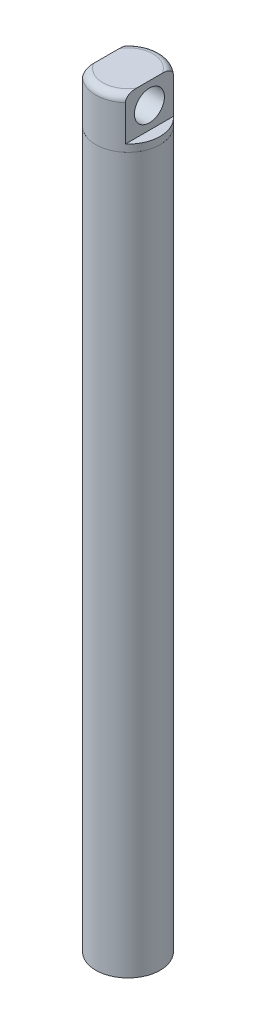
ISO-10303-21;
HEADER;
FILE_DESCRIPTION(('STEP AP214'),'2;1');
FILE_NAME('part.step','',(''),(''),'','','');
FILE_SCHEMA(('AUTOMOTIVE_DESIGN { 1 0 10303 214 1 1 1 1 }'));
ENDSEC;
DATA;
#1=APPLICATION_CONTEXT('core data for automotive mechanical design processes');
#2=APPLICATION_PROTOCOL_DEFINITION('international standard','automotive_design',2000,#1);
#3=PRODUCT_CONTEXT('',#1,'mechanical');
#4=PRODUCT('Part','Part','',(#3));
#5=PRODUCT_RELATED_PRODUCT_CATEGORY('part','',(#4));
#6=PRODUCT_DEFINITION_FORMATION('','',#4);
#7=PRODUCT_DEFINITION_CONTEXT('part definition',#1,'design');
#8=PRODUCT_DEFINITION('design','',#6,#7);
#9=PRODUCT_DEFINITION_SHAPE('','',#8);
#10=(LENGTH_UNIT() NAMED_UNIT(*) SI_UNIT(.MILLI.,.METRE.));
#11=(NAMED_UNIT(*) PLANE_ANGLE_UNIT() SI_UNIT($,.RADIAN.));
#12=(NAMED_UNIT(*) SI_UNIT($,.STERADIAN.) SOLID_ANGLE_UNIT());
#13=UNCERTAINTY_MEASURE_WITH_UNIT(LENGTH_MEASURE(1.E-05),#10,'distance_accuracy_value','');
#14=(GEOMETRIC_REPRESENTATION_CONTEXT(3) GLOBAL_UNCERTAINTY_ASSIGNED_CONTEXT((#13)) GLOBAL_UNIT_ASSIGNED_CONTEXT((#10,
#11,#12)) REPRESENTATION_CONTEXT('',''));
#15=CARTESIAN_POINT('',(0.,0.,0.));
#16=DIRECTION('',(0.,0.,1.));
#17=DIRECTION('',(1.,0.,0.));
#18=AXIS2_PLACEMENT_3D('',#15,#16,#17);
#19=CARTESIAN_POINT('',(0.,106.,0.));
#20=DIRECTION('',(0.,1.,0.));
#21=DIRECTION('',(0.,0.,1.));
#22=AXIS2_PLACEMENT_3D('',#19,#20,#21);
#23=TOROIDAL_SURFACE('',#22,3.5,1.);
#24=CARTESIAN_POINT('',(3.,106.866025403784,0.));
#25=CARTESIAN_POINT('',(3.,106.866026286301,0.0834517471953684));
#26=CARTESIAN_POINT('',(3.,106.868069513741,0.166903998806668));
#27=CARTESIAN_POINT('',(3.,106.87584863679,0.333639664685969));
#28=CARTESIAN_POINT('',(3.,106.88158519628,0.416923045898892));
#29=CARTESIAN_POINT('',(3.,106.895716845417,0.583498480753847));
#30=CARTESIAN_POINT('',(3.,106.904119754815,0.666789830229409));
#31=CARTESIAN_POINT('',(3.,106.922141868487,0.833243996581531));
#32=CARTESIAN_POINT('',(3.,106.931761229342,0.916406795513423));
#33=CARTESIAN_POINT('',(3.,106.960082315359,1.16601805397348));
#34=CARTESIAN_POINT('',(3.,106.978239999142,1.33253177341861));
#35=CARTESIAN_POINT('',(3.,107.000279577082,1.66626104574715));
#36=CARTESIAN_POINT('',(3.,107.004224191262,1.83347024717901));
#37=CARTESIAN_POINT('',(3.,106.988501615269,2.10036002541898));
#38=CARTESIAN_POINT('',(3.,106.977593665204,2.20047327964223));
#39=CARTESIAN_POINT('',(3.,106.94247214096,2.3984600870939));
#40=CARTESIAN_POINT('',(3.,106.918272030977,2.49633580249428));
#41=CARTESIAN_POINT('',(3.,106.862118669104,2.66021999455933));
#42=CARTESIAN_POINT('',(3.,106.834143695318,2.72757335224792));
#43=CARTESIAN_POINT('',(3.,106.768140807545,2.85722348604431));
#44=CARTESIAN_POINT('',(3.,106.730126298243,2.91952686093832));
#45=CARTESIAN_POINT('',(3.,106.653830412579,3.02182957875492));
#46=CARTESIAN_POINT('',(3.,106.617880636905,3.06356041002552));
#47=CARTESIAN_POINT('',(3.,106.539726833187,3.14071374211422));
#48=CARTESIAN_POINT('',(3.,106.497530411523,3.17614380130895));
#49=CARTESIAN_POINT('',(3.,106.41469106752,3.23369524158128));
#50=CARTESIAN_POINT('',(3.,106.374902921079,3.25704265684224));
#51=CARTESIAN_POINT('',(3.,106.291977400959,3.29680095467215));
#52=CARTESIAN_POINT('',(3.,106.248841383379,3.31321462866271));
#53=CARTESIAN_POINT('',(3.,106.160105724501,3.33818980325098));
#54=CARTESIAN_POINT('',(3.,106.114495278766,3.34671334113168));
#55=CARTESIAN_POINT('',(3.,106.022484403516,3.35518843271109));
#56=CARTESIAN_POINT('',(3.,105.976084212116,3.35514252592834));
#57=CARTESIAN_POINT('',(3.,105.887963479436,3.34685839797715));
#58=CARTESIAN_POINT('',(3.,105.846176259554,3.3393060430682));
#59=CARTESIAN_POINT('',(3.,105.764418057278,3.31745795535656));
#60=CARTESIAN_POINT('',(3.,105.724447113196,3.30316208037797));
#61=CARTESIAN_POINT('',(3.,105.646228882559,3.26811348997346));
#62=CARTESIAN_POINT('',(3.,105.60805223117,3.24720437183111));
#63=CARTESIAN_POINT('',(3.,105.535194505614,3.20002616756865));
#64=CARTESIAN_POINT('',(3.,105.500514776384,3.17375503084328));
#65=CARTESIAN_POINT('',(3.,105.421437143722,3.10504382693179));
#66=CARTESIAN_POINT('',(3.,105.37894278689,3.06040757837977));
#67=CARTESIAN_POINT('',(3.,105.301746490488,2.96481689919324));
#68=CARTESIAN_POINT('',(3.,105.267063201003,2.91384778844787));
#69=CARTESIAN_POINT('',(3.,105.192303422973,2.78560612999682));
#70=CARTESIAN_POINT('',(3.,105.155938507536,2.70617971143325));
#71=CARTESIAN_POINT('',(3.,105.096120012451,2.54282970548437));
#72=CARTESIAN_POINT('',(3.,105.072669165128,2.45890517051772));
#73=CARTESIAN_POINT('',(3.,105.023031815073,2.22666516370937));
#74=CARTESIAN_POINT('',(3.,105.00738452876,2.07614026343828));
#75=CARTESIAN_POINT('',(3.,104.999447639367,1.84991504410093));
#76=CARTESIAN_POINT('',(3.,104.999418609496,1.77416658998332));
#77=CARTESIAN_POINT('',(3.,105.003346633604,1.62276821749299));
#78=CARTESIAN_POINT('',(3.,105.007302345558,1.54711827453168));
#79=CARTESIAN_POINT('',(3.,105.024812715784,1.29944276329937));
#80=CARTESIAN_POINT('',(3.,105.044173518845,1.1279025070591));
#81=CARTESIAN_POINT('',(3.,105.073478877622,0.870693964899819));
#82=CARTESIAN_POINT('',(3.,105.083292052611,0.784968758995232));
#83=CARTESIAN_POINT('',(3.,105.101295573714,0.613351828490696));
#84=CARTESIAN_POINT('',(3.,105.109486325743,0.52746015098456));
#85=CARTESIAN_POINT('',(3.,105.122709587863,0.355744570636353));
#86=CARTESIAN_POINT('',(3.,105.127753847286,0.269921625423852));
#87=CARTESIAN_POINT('',(3.,105.133732696317,0.0981335389456682));
#88=CARTESIAN_POINT('',(3.,105.134667838882,0.0121684183698835));
#89=CARTESIAN_POINT('',(3.,105.132235520251,-0.15970426218142));
#90=CARTESIAN_POINT('',(3.,105.128867649188,-0.245611815893743));
#91=CARTESIAN_POINT('',(3.,105.11851476665,-0.417212679495672));
#92=CARTESIAN_POINT('',(3.,105.111529012978,-0.502905941798178));
#93=CARTESIAN_POINT('',(3.,105.091495229534,-0.713613924531289));
#94=CARTESIAN_POINT('',(3.,105.077137602194,-0.838493648866297));
#95=CARTESIAN_POINT('',(3.,105.04868535999,-1.08839225923842));
#96=CARTESIAN_POINT('',(3.,105.03459098512,-1.21341117174104));
#97=CARTESIAN_POINT('',(3.,105.012133980539,-1.46384535530208));
#98=CARTESIAN_POINT('',(3.,105.003762620261,-1.58925972809784));
#99=CARTESIAN_POINT('',(3.,104.998219259439,-1.84027654502362));
#100=CARTESIAN_POINT('',(3.,105.001024205682,-1.96587806837808));
#101=CARTESIAN_POINT('',(3.,105.021916837183,-2.19624907955));
#102=CARTESIAN_POINT('',(3.,105.037557217298,-2.30121746623258));
#103=CARTESIAN_POINT('',(3.,105.08498112058,-2.50766710538857));
#104=CARTESIAN_POINT('',(3.,105.116744344481,-2.6091525718728));
#105=CARTESIAN_POINT('',(3.,105.184070694659,-2.76567817678709));
#106=CARTESIAN_POINT('',(3.,105.213337607539,-2.8234154181131));
#107=CARTESIAN_POINT('',(3.,105.280149035967,-2.93390726680728));
#108=CARTESIAN_POINT('',(3.,105.317681781157,-2.98666880839458));
#109=CARTESIAN_POINT('',(3.,105.393939590575,-3.07607760347389));
#110=CARTESIAN_POINT('',(3.,105.4312553595,-3.11392004609524));
#111=CARTESIAN_POINT('',(3.,105.511596775661,-3.18300634990281));
#112=CARTESIAN_POINT('',(3.,105.55461696113,-3.21425644977331));
#113=CARTESIAN_POINT('',(3.,105.638622860047,-3.26419536670202));
#114=CARTESIAN_POINT('',(3.,105.678896278021,-3.28407888168108));
#115=CARTESIAN_POINT('',(3.,105.762211038729,-3.31684193885748));
#116=CARTESIAN_POINT('',(3.,105.805251077313,-3.32972475440979));
#117=CARTESIAN_POINT('',(3.,105.893102671769,-3.34775314086767));
#118=CARTESIAN_POINT('',(3.,105.937920125386,-3.3528702717421));
#119=CARTESIAN_POINT('',(3.,106.027743308671,-3.35493817949967));
#120=CARTESIAN_POINT('',(3.,106.072749017244,-3.35188984808491));
#121=CARTESIAN_POINT('',(3.,106.158696042096,-3.33827843073191));
#122=CARTESIAN_POINT('',(3.,106.199715368863,-3.32819798488055));
#123=CARTESIAN_POINT('',(3.,106.279595674113,-3.30160476966194));
#124=CARTESIAN_POINT('',(3.,106.31845651573,-3.28509159293431));
#125=CARTESIAN_POINT('',(3.,106.395066020271,-3.24548117625212));
#126=CARTESIAN_POINT('',(3.,106.432667962598,-3.22210205901262));
#127=CARTESIAN_POINT('',(3.,106.504093315434,-3.17017674135951));
#128=CARTESIAN_POINT('',(3.,106.537914783826,-3.14162790469481));
#129=CARTESIAN_POINT('',(3.,106.615996059399,-3.06642514614128));
#130=CARTESIAN_POINT('',(3.,106.658015743137,-3.01743896862333));
#131=CARTESIAN_POINT('',(3.,106.733595370318,-2.91331685138252));
#132=CARTESIAN_POINT('',(3.,106.767135892391,-2.85816720327175));
#133=CARTESIAN_POINT('',(3.,106.839493679565,-2.71837917665725));
#134=CARTESIAN_POINT('',(3.,106.874023481822,-2.63153434184875));
#135=CARTESIAN_POINT('',(3.,106.929186890092,-2.45374936404672));
#136=CARTESIAN_POINT('',(3.,106.949813150706,-2.36280708334932));
#137=CARTESIAN_POINT('',(3.,106.982653516735,-2.16289372034955));
#138=CARTESIAN_POINT('',(3.,106.992724633047,-2.05358775373566));
#139=CARTESIAN_POINT('',(3.,107.001671782326,-1.83445979703006));
#140=CARTESIAN_POINT('',(3.,107.000525057907,-1.72463720991488));
#141=CARTESIAN_POINT('',(3.,106.99078711859,-1.50455311880942));
#142=CARTESIAN_POINT('',(3.,106.982138757424,-1.3942947282987));
#143=CARTESIAN_POINT('',(3.,106.961045022905,-1.17426191491652));
#144=CARTESIAN_POINT('',(3.,106.948602239244,-1.06448721360403));
#145=CARTESIAN_POINT('',(3.,106.927028681388,-0.87515573880633));
#146=CARTESIAN_POINT('',(3.,106.917928560141,-0.795594760994107));
#147=CARTESIAN_POINT('',(3.,106.901027244392,-0.636304804130985));
#148=CARTESIAN_POINT('',(3.,106.893226412661,-0.556575784432957));
#149=CARTESIAN_POINT('',(3.,106.880204068257,-0.397414149405096));
#150=CARTESIAN_POINT('',(3.,106.874966221991,-0.317982945555855));
#151=CARTESIAN_POINT('',(3.,106.867878037735,-0.159034548430334));
#152=CARTESIAN_POINT('',(3.,106.866024562873,-0.0795175032035244));
#153=CARTESIAN_POINT('',(3.,106.866025403784,0.));
#154=B_SPLINE_CURVE_WITH_KNOTS('',3,(#24,#25,#26,#27,#28,#29,#30,#31,#32,#33,#34,#35,#36,#37,
#38,#39,#40,#41,#42,#43,#44,#45,#46,#47,#48,#49,#50,#51,#52,#53,#54,#55,#56,#57,#58,#59,#60,#61,
#62,#63,#64,#65,#66,#67,#68,#69,#70,#71,#72,#73,#74,#75,#76,#77,#78,#79,#80,#81,#82,#83,#84,#85,
#86,#87,#88,#89,#90,#91,#92,#93,#94,#95,#96,#97,#98,#99,#100,#101,#102,#103,#104,#105,#106,#107,
#108,#109,#110,#111,#112,#113,#114,#115,#116,#117,#118,#119,#120,#121,#122,#123,#124,#125,#126,
#127,#128,#129,#130,#131,#132,#133,#134,#135,#136,#137,#138,#139,#140,#141,#142,#143,#144,#145,
#146,#147,#148,#149,#150,#151,#152,#153),.UNSPECIFIED.,.T.,.F.,(4,2,2,2,2,2,2,2,2,2,2,2,2,2,2,2,
2,2,2,2,2,2,2,2,2,2,2,2,2,2,2,2,2,2,2,2,2,2,2,2,2,2,2,2,2,2,2,2,2,2,2,2,2,2,2,2,2,2,2,2,2,2,2,2,
4),(0.,0.250334661961346,0.500714334443582,0.75183520373641,1.00298843064367,1.50546897934761,
2.00572942653872,2.30721399818868,2.60839374494604,2.82652003983434,3.0443565543723,
3.20900331232186,3.37345120855728,3.51127157814115,3.64903641028458,3.787460692365,
3.92584395306234,4.05264710106093,4.17945292261257,4.30951553083206,4.43962797261444,
4.62348967675681,4.80778583060464,5.06837885726143,5.32902699835408,5.78027304762402,
6.00749938865658,6.23464922754932,6.75232010552282,7.01119179927517,7.26999864368739,
7.52783319839428,7.78563305568107,8.04345747058481,8.30133479824535,8.67842126468523,
9.05583619974377,9.43267408864264,9.80873508202229,10.1262484112162,10.4433629671447,
10.6369909057611,10.8303448851517,10.9891773798358,11.1478588818106,11.2820280550909,
11.4161344400662,11.5507307835271,11.6853124291122,11.811464648825,11.9376248585769,
12.0699391530408,12.2023211109535,12.3948565790574,12.5878291302379,12.8666253834854,
13.1455688127506,13.4740242651834,13.8031461859691,14.1347975454271,14.4662230576457,
14.7064624627522,14.9467688322527,15.18552313929,15.4240560394804),.UNSPECIFIED.);
#155=CARTESIAN_POINT('',(3.,107.,1.80277563773199));
#156=VERTEX_POINT('',#155);
#157=CARTESIAN_POINT('',(3.,105.999999999999,3.3541019662507));
#158=VERTEX_POINT('',#157);
#159=EDGE_CURVE('E48',#156,#158,#154,.T.);
#160=ORIENTED_EDGE('',*,*,#159,.F.);
#161=CARTESIAN_POINT('',(0.,107.,0.));
#162=DIRECTION('',(0.,1.,0.));
#163=DIRECTION('',(0.,0.,1.));
#164=AXIS2_PLACEMENT_3D('',#161,#162,#163);
#165=CIRCLE('',#164,3.5);
#166=CARTESIAN_POINT('',(-3.,107.,1.802775637732));
#167=VERTEX_POINT('',#166);
#168=EDGE_CURVE('E126',#167,#156,#165,.T.);
#169=ORIENTED_EDGE('',*,*,#168,.F.);
#170=CARTESIAN_POINT('',(-3.,106.866025403784,0.));
#171=CARTESIAN_POINT('',(-3.,106.866026286301,-0.0834517471953683));
#172=CARTESIAN_POINT('',(-3.,106.868069513741,-0.166903998806668));
#173=CARTESIAN_POINT('',(-3.,106.87584863679,-0.333639664685969));
#174=CARTESIAN_POINT('',(-3.,106.88158519628,-0.416923045898891));
#175=CARTESIAN_POINT('',(-3.,106.895716845417,-0.583498480753847));
#176=CARTESIAN_POINT('',(-3.,106.904119754815,-0.666789830229409));
#177=CARTESIAN_POINT('',(-3.,106.922141868486,-0.833243996581531));
#178=CARTESIAN_POINT('',(-3.,106.931761229342,-0.916406795513423));
#179=CARTESIAN_POINT('',(-3.,106.960082315359,-1.16601805397347));
#180=CARTESIAN_POINT('',(-3.,106.978239999142,-1.33253177341861));
#181=CARTESIAN_POINT('',(-3.,107.000279577082,-1.66626104574715));
#182=CARTESIAN_POINT('',(-3.,107.004224191262,-1.83347024717901));
#183=CARTESIAN_POINT('',(-3.,106.988501615269,-2.10036002541898));
#184=CARTESIAN_POINT('',(-3.,106.977593665204,-2.20047327964223));
#185=CARTESIAN_POINT('',(-3.,106.94247214096,-2.3984600870939));
#186=CARTESIAN_POINT('',(-3.,106.918272030977,-2.49633580249428));
#187=CARTESIAN_POINT('',(-3.,106.862118669104,-2.66021999455933));
#188=CARTESIAN_POINT('',(-3.,106.834143695318,-2.72757335224792));
#189=CARTESIAN_POINT('',(-3.,106.768140807545,-2.85722348604432));
#190=CARTESIAN_POINT('',(-3.,106.730126298243,-2.91952686093832));
#191=CARTESIAN_POINT('',(-3.,106.653830412579,-3.02182957875492));
#192=CARTESIAN_POINT('',(-3.,106.617880636905,-3.06356041002553));
#193=CARTESIAN_POINT('',(-3.,106.539726833187,-3.14071374211422));
#194=CARTESIAN_POINT('',(-3.,106.497530411523,-3.17614380130895));
#195=CARTESIAN_POINT('',(-3.,106.41469106752,-3.23369524158129));
#196=CARTESIAN_POINT('',(-3.,106.374902921079,-3.25704265684224));
#197=CARTESIAN_POINT('',(-3.,106.291977400959,-3.29680095467215));
#198=CARTESIAN_POINT('',(-3.,106.248841383379,-3.31321462866271));
#199=CARTESIAN_POINT('',(-3.,106.160105724501,-3.33818980325099));
#200=CARTESIAN_POINT('',(-3.,106.114495278766,-3.34671334113169));
#201=CARTESIAN_POINT('',(-3.,106.022484403516,-3.3551884327111));
#202=CARTESIAN_POINT('',(-3.,105.976084212116,-3.35514252592835));
#203=CARTESIAN_POINT('',(-3.,105.887963479436,-3.34685839797715));
#204=CARTESIAN_POINT('',(-3.,105.846176259554,-3.3393060430682));
#205=CARTESIAN_POINT('',(-3.,105.764418057278,-3.31745795535656));
#206=CARTESIAN_POINT('',(-3.,105.724447113196,-3.30316208037797));
#207=CARTESIAN_POINT('',(-3.,105.646228882559,-3.26811348997346));
#208=CARTESIAN_POINT('',(-3.,105.60805223117,-3.24720437183112));
#209=CARTESIAN_POINT('',(-3.,105.535194505614,-3.20002616756865));
#210=CARTESIAN_POINT('',(-3.,105.500514776384,-3.17375503084328));
#211=CARTESIAN_POINT('',(-3.,105.421437143722,-3.10504382693178));
#212=CARTESIAN_POINT('',(-3.,105.37894278689,-3.06040757837976));
#213=CARTESIAN_POINT('',(-3.,105.301746490488,-2.96481689919323));
#214=CARTESIAN_POINT('',(-3.,105.267063201003,-2.91384778844785));
#215=CARTESIAN_POINT('',(-3.,105.192303422973,-2.78560612999681));
#216=CARTESIAN_POINT('',(-3.,105.155938507535,-2.70617971143325));
#217=CARTESIAN_POINT('',(-3.,105.096120012451,-2.54282970548437));
#218=CARTESIAN_POINT('',(-3.,105.072669165128,-2.45890517051772));
#219=CARTESIAN_POINT('',(-3.,105.023031815073,-2.22666516370937));
#220=CARTESIAN_POINT('',(-3.,105.00738452876,-2.07614026343828));
#221=CARTESIAN_POINT('',(-3.,104.999447639367,-1.84991504410093));
#222=CARTESIAN_POINT('',(-3.,104.999418609496,-1.77416658998333));
#223=CARTESIAN_POINT('',(-3.,105.003346633604,-1.62276821749299));
#224=CARTESIAN_POINT('',(-3.,105.007302345558,-1.54711827453169));
#225=CARTESIAN_POINT('',(-3.,105.024812715784,-1.29944276329937));
#226=CARTESIAN_POINT('',(-3.,105.044173518845,-1.12790250705911));
#227=CARTESIAN_POINT('',(-3.,105.073478877622,-0.870693964899825));
#228=CARTESIAN_POINT('',(-3.,105.083292052611,-0.784968758995239));
#229=CARTESIAN_POINT('',(-3.,105.101295573714,-0.613351828490703));
#230=CARTESIAN_POINT('',(-3.,105.109486325743,-0.527460150984568));
#231=CARTESIAN_POINT('',(-3.,105.122709587863,-0.355744570636361));
#232=CARTESIAN_POINT('',(-3.,105.127753847286,-0.26992162542386));
#233=CARTESIAN_POINT('',(-3.,105.133732696317,-0.0981335389456773));
#234=CARTESIAN_POINT('',(-3.,105.134667838882,-0.012168418369893));
#235=CARTESIAN_POINT('',(-3.,105.132235520251,0.15970426218141));
#236=CARTESIAN_POINT('',(-3.,105.128867649188,0.245611815893732));
#237=CARTESIAN_POINT('',(-3.,105.11851476665,0.41721267949566));
#238=CARTESIAN_POINT('',(-3.,105.111529012978,0.502905941798166));
#239=CARTESIAN_POINT('',(-3.,105.091495229534,0.713613924531282));
#240=CARTESIAN_POINT('',(-3.,105.077137602194,0.838493648866296));
#241=CARTESIAN_POINT('',(-3.,105.04868535999,1.08839225923843));
#242=CARTESIAN_POINT('',(-3.,105.03459098512,1.21341117174105));
#243=CARTESIAN_POINT('',(-3.,105.012133980539,1.4638453553021));
#244=CARTESIAN_POINT('',(-3.,105.003762620261,1.58925972809786));
#245=CARTESIAN_POINT('',(-3.,104.998219259439,1.84027654502365));
#246=CARTESIAN_POINT('',(-3.,105.001024205682,1.96587806837811));
#247=CARTESIAN_POINT('',(-3.,105.021916837183,2.19624907955003));
#248=CARTESIAN_POINT('',(-3.,105.037557217298,2.3012174662326));
#249=CARTESIAN_POINT('',(-3.,105.08498112058,2.50766710538858));
#250=CARTESIAN_POINT('',(-3.,105.116744344481,2.60915257187282));
#251=CARTESIAN_POINT('',(-3.,105.184070694659,2.7656781767871));
#252=CARTESIAN_POINT('',(-3.,105.213337607539,2.8234154181131));
#253=CARTESIAN_POINT('',(-3.,105.280149035967,2.93390726680729));
#254=CARTESIAN_POINT('',(-3.,105.317681781157,2.9866688083946));
#255=CARTESIAN_POINT('',(-3.,105.393939590575,3.07607760347391));
#256=CARTESIAN_POINT('',(-3.,105.4312553595,3.11392004609525));
#257=CARTESIAN_POINT('',(-3.,105.511596775661,3.18300634990281));
#258=CARTESIAN_POINT('',(-3.,105.55461696113,3.21425644977331));
#259=CARTESIAN_POINT('',(-3.,105.638622860047,3.26419536670203));
#260=CARTESIAN_POINT('',(-3.,105.678896278021,3.28407888168108));
#261=CARTESIAN_POINT('',(-3.,105.762211038729,3.31684193885748));
#262=CARTESIAN_POINT('',(-3.,105.805251077313,3.32972475440979));
#263=CARTESIAN_POINT('',(-3.,105.893102671769,3.34775314086767));
#264=CARTESIAN_POINT('',(-3.,105.937920125386,3.3528702717421));
#265=CARTESIAN_POINT('',(-3.,106.027743308671,3.35493817949967));
#266=CARTESIAN_POINT('',(-3.,106.072749017244,3.35188984808491));
#267=CARTESIAN_POINT('',(-3.,106.158696042096,3.33827843073191));
#268=CARTESIAN_POINT('',(-3.,106.199715368863,3.32819798488056));
#269=CARTESIAN_POINT('',(-3.,106.279595674113,3.30160476966195));
#270=CARTESIAN_POINT('',(-3.,106.31845651573,3.28509159293432));
#271=CARTESIAN_POINT('',(-3.,106.395066020271,3.24548117625213));
#272=CARTESIAN_POINT('',(-3.,106.432667962598,3.22210205901262));
#273=CARTESIAN_POINT('',(-3.,106.504093315434,3.17017674135951));
#274=CARTESIAN_POINT('',(-3.,106.537914783826,3.14162790469482));
#275=CARTESIAN_POINT('',(-3.,106.615996059399,3.06642514614129));
#276=CARTESIAN_POINT('',(-3.,106.658015743137,3.01743896862333));
#277=CARTESIAN_POINT('',(-3.,106.733595370318,2.91331685138252));
#278=CARTESIAN_POINT('',(-3.,106.767135892391,2.85816720327175));
#279=CARTESIAN_POINT('',(-3.,106.839493679565,2.71837917665725));
#280=CARTESIAN_POINT('',(-3.,106.874023481822,2.63153434184875));
#281=CARTESIAN_POINT('',(-3.,106.929186890092,2.45374936404672));
#282=CARTESIAN_POINT('',(-3.,106.949813150706,2.36280708334932));
#283=CARTESIAN_POINT('',(-3.,106.982653516735,2.16289372034955));
#284=CARTESIAN_POINT('',(-3.,106.992724633047,2.05358775373567));
#285=CARTESIAN_POINT('',(-3.,107.001671782326,1.83445979703006));
#286=CARTESIAN_POINT('',(-3.,107.000525057907,1.72463720991488));
#287=CARTESIAN_POINT('',(-3.,106.99078711859,1.50455311880943));
#288=CARTESIAN_POINT('',(-3.,106.982138757424,1.39429472829871));
#289=CARTESIAN_POINT('',(-3.,106.961045022905,1.17426191491653));
#290=CARTESIAN_POINT('',(-3.,106.948602239244,1.06448721360404));
#291=CARTESIAN_POINT('',(-3.,106.927028681388,0.875155738806337));
#292=CARTESIAN_POINT('',(-3.,106.917928560141,0.795594760994113));
#293=CARTESIAN_POINT('',(-3.,106.901027244392,0.63630480413099));
#294=CARTESIAN_POINT('',(-3.,106.893226412661,0.556575784432961));
#295=CARTESIAN_POINT('',(-3.,106.880204068257,0.397414149405099));
#296=CARTESIAN_POINT('',(-3.,106.874966221991,0.317982945555857));
#297=CARTESIAN_POINT('',(-3.,106.867878037735,0.159034548430336));
#298=CARTESIAN_POINT('',(-3.,106.866024562873,0.0795175032035252));
#299=CARTESIAN_POINT('',(-3.,106.866025403784,0.));
#300=B_SPLINE_CURVE_WITH_KNOTS('',3,(#170,#171,#172,#173,#174,#175,#176,#177,#178,#179,#180,
#181,#182,#183,#184,#185,#186,#187,#188,#189,#190,#191,#192,#193,#194,#195,#196,#197,#198,#199,
#200,#201,#202,#203,#204,#205,#206,#207,#208,#209,#210,#211,#212,#213,#214,#215,#216,#217,#218,
#219,#220,#221,#222,#223,#224,#225,#226,#227,#228,#229,#230,#231,#232,#233,#234,#235,#236,#237,
#238,#239,#240,#241,#242,#243,#244,#245,#246,#247,#248,#249,#250,#251,#252,#253,#254,#255,#256,
#257,#258,#259,#260,#261,#262,#263,#264,#265,#266,#267,#268,#269,#270,#271,#272,#273,#274,#275,
#276,#277,#278,#279,#280,#281,#282,#283,#284,#285,#286,#287,#288,#289,#290,#291,#292,#293,#294,
#295,#296,#297,#298,#299),.UNSPECIFIED.,.T.,.F.,(4,2,2,2,2,2,2,2,2,2,2,2,2,2,2,2,2,2,2,2,2,2,2,
2,2,2,2,2,2,2,2,2,2,2,2,2,2,2,2,2,2,2,2,2,2,2,2,2,2,2,2,2,2,2,2,2,2,2,2,2,2,2,2,2,4),(0.,
0.250334661961346,0.500714334443582,0.751835203736409,1.00298843064367,1.50546897934761,
2.00572942653872,2.30721399818869,2.60839374494604,2.82652003983434,3.04435655437231,
3.20900331232186,3.37345120855728,3.51127157814115,3.64903641028458,3.78746069236502,
3.92584395306235,4.05264710106093,4.17945292261258,4.30951553083207,4.43962797261444,
4.62348967675683,4.80778583060465,5.06837885726144,5.32902699835409,5.78027304762403,
6.00749938865658,6.23464922754933,6.75232010552282,7.01119179927517,7.26999864368739,
7.52783319839428,7.78563305568107,8.0434574705848,8.30133479824535,8.67842126468524,
9.05583619974379,9.43267408864268,9.80873508202234,10.1262484112162,10.4433629671448,
10.6369909057612,10.8303448851518,10.9891773798358,11.1478588818107,11.2820280550909,
11.4161344400662,11.5507307835271,11.6853124291122,11.811464648825,11.9376248585769,
12.0699391530408,12.2023211109535,12.3948565790574,12.5878291302379,12.8666253834854,
13.1455688127506,13.4740242651834,13.8031461859691,14.1347975454271,14.4662230576457,
14.7064624627522,14.9467688322527,15.18552313929,15.4240560394804),.UNSPECIFIED.);
#301=CARTESIAN_POINT('',(-3.,106.,3.35410196624969));
#302=VERTEX_POINT('',#301);
#303=EDGE_CURVE('E130',#302,#167,#300,.T.);
#304=ORIENTED_EDGE('',*,*,#303,.F.);
#305=CARTESIAN_POINT('',(0.,106.,0.));
#306=DIRECTION('',(0.,1.,0.));
#307=DIRECTION('',(0.,0.,1.));
#308=AXIS2_PLACEMENT_3D('',#305,#306,#307);
#309=CIRCLE('',#308,4.5);
#310=EDGE_CURVE('E63',#158,#302,#309,.F.);
#311=ORIENTED_EDGE('',*,*,#310,.F.);
#312=EDGE_LOOP('',(#160,#169,#304,#311));
#313=FACE_BOUND('',#312,.T.);
#314=ADVANCED_FACE('F39',(#313),#23,.T.);
#315=CARTESIAN_POINT('',(0.,107.,0.));
#316=DIRECTION('',(0.,-1.,0.));
#317=DIRECTION('',(0.,0.,-1.));
#318=AXIS2_PLACEMENT_3D('',#315,#316,#317);
#319=CYLINDRICAL_SURFACE('',#318,4.5);
#320=CARTESIAN_POINT('',(-3.,105.999999999999,-3.35410196625071));
#321=VERTEX_POINT('',#320);
#322=CARTESIAN_POINT('',(3.,106.,-3.35410196624968));
#323=VERTEX_POINT('',#322);
#324=EDGE_CURVE('E107',#321,#323,#309,.F.);
#325=ORIENTED_EDGE('',*,*,#324,.T.);
#326=DIRECTION('',(0.,-1.,0.));
#327=VECTOR('',#326,1.);
#328=CARTESIAN_POINT('',(3.,107.,-3.35410196624968));
#329=LINE('',#328,#327);
#330=CARTESIAN_POINT('',(3.,101.,-3.35410196624968));
#331=VERTEX_POINT('',#330);
#332=EDGE_CURVE('E55',#323,#331,#329,.T.);
#333=ORIENTED_EDGE('',*,*,#332,.T.);
#334=CARTESIAN_POINT('',(0.,101.,0.));
#335=DIRECTION('',(0.,-1.,0.));
#336=DIRECTION('',(0.,0.,-1.));
#337=AXIS2_PLACEMENT_3D('',#334,#335,#336);
#338=CIRCLE('',#337,4.5);
#339=CARTESIAN_POINT('',(3.,101.,3.35410196624968));
#340=VERTEX_POINT('',#339);
#341=EDGE_CURVE('E12',#331,#340,#338,.T.);
#342=ORIENTED_EDGE('',*,*,#341,.T.);
#343=DIRECTION('',(0.,-1.,0.));
#344=VECTOR('',#343,1.);
#345=CARTESIAN_POINT('',(3.,107.,3.35410196624968));
#346=LINE('',#345,#344);
#347=EDGE_CURVE('E98',#340,#158,#346,.F.);
#348=ORIENTED_EDGE('',*,*,#347,.T.);
#349=ORIENTED_EDGE('',*,*,#310,.T.);
#350=DIRECTION('',(0.,-1.,0.));
#351=VECTOR('',#350,1.);
#352=CARTESIAN_POINT('',(-3.,107.,3.35410196624969));
#353=LINE('',#352,#351);
#354=CARTESIAN_POINT('',(-3.,101.,3.35410196624969));
#355=VERTEX_POINT('',#354);
#356=EDGE_CURVE('E118',#302,#355,#353,.T.);
#357=ORIENTED_EDGE('',*,*,#356,.T.);
#358=CARTESIAN_POINT('',(0.,101.,0.));
#359=DIRECTION('',(0.,-1.,0.));
#360=DIRECTION('',(0.,0.,-1.));
#361=AXIS2_PLACEMENT_3D('',#358,#359,#360);
#362=CIRCLE('',#361,4.5);
#363=CARTESIAN_POINT('',(-3.,101.,-3.35410196624969));
#364=VERTEX_POINT('',#363);
#365=EDGE_CURVE('E136',#355,#364,#362,.T.);
#366=ORIENTED_EDGE('',*,*,#365,.T.);
#367=DIRECTION('',(0.,-1.,0.));
#368=VECTOR('',#367,1.);
#369=CARTESIAN_POINT('',(-3.,107.,-3.35410196624969));
#370=LINE('',#369,#368);
#371=EDGE_CURVE('E120',#364,#321,#370,.F.);
#372=ORIENTED_EDGE('',*,*,#371,.T.);
#373=EDGE_LOOP('',(#325,#333,#342,#348,#349,#357,#366,#372));
#374=FACE_BOUND('',#373,.T.);
#375=CARTESIAN_POINT('',(0.,100.,0.));
#376=DIRECTION('',(0.,1.,0.));
#377=DIRECTION('',(0.,0.,1.));
#378=AXIS2_PLACEMENT_3D('',#375,#376,#377);
#379=CIRCLE('',#378,4.5);
#380=CARTESIAN_POINT('',(0.,100.,4.5));
#381=VERTEX_POINT('',#380);
#382=EDGE_CURVE('E122',#381,#381,#379,.T.);
#383=ORIENTED_EDGE('',*,*,#382,.T.);
#384=EDGE_LOOP('',(#383));
#385=FACE_BOUND('',#384,.T.);
#386=ADVANCED_FACE('F103',(#374,#385),#319,.T.);
#387=CARTESIAN_POINT('',(0.,107.,0.));
#388=DIRECTION('',(0.,1.,0.));
#389=DIRECTION('',(0.,0.,1.));
#390=AXIS2_PLACEMENT_3D('',#387,#388,#389);
#391=PLANE('',#390);
#392=DIRECTION('',(0.,0.,1.));
#393=VECTOR('',#392,1.);
#394=CARTESIAN_POINT('',(3.,107.,0.));
#395=LINE('',#394,#393);
#396=CARTESIAN_POINT('',(3.,107.,-1.80277563773199));
#397=VERTEX_POINT('',#396);
#398=EDGE_CURVE('E99',#397,#156,#395,.T.);
#399=ORIENTED_EDGE('',*,*,#398,.F.);
#400=CARTESIAN_POINT('',(-3.,107.,-1.802775637732));
#401=VERTEX_POINT('',#400);
#402=EDGE_CURVE('E125',#397,#401,#165,.T.);
#403=ORIENTED_EDGE('',*,*,#402,.T.);
#404=DIRECTION('',(0.,0.,-1.));
#405=VECTOR('',#404,1.);
#406=CARTESIAN_POINT('',(-3.,107.,0.));
#407=LINE('',#406,#405);
#408=EDGE_CURVE('E115',#167,#401,#407,.T.);
#409=ORIENTED_EDGE('',*,*,#408,.F.);
#410=ORIENTED_EDGE('',*,*,#168,.T.);
#411=EDGE_LOOP('',(#399,#403,#409,#410));
#412=FACE_BOUND('',#411,.T.);
#413=ADVANCED_FACE('F149',(#412),#391,.T.);
#414=CARTESIAN_POINT('',(0.,100.,0.));
#415=DIRECTION('',(0.,1.,0.));
#416=DIRECTION('',(0.,0.,1.));
#417=AXIS2_PLACEMENT_3D('',#414,#415,#416);
#418=PLANE('',#417);
#419=ORIENTED_EDGE('',*,*,#382,.F.);
#420=EDGE_LOOP('',(#419));
#421=FACE_BOUND('',#420,.T.);
#422=ADVANCED_FACE('F152',(#421),#418,.F.);
#423=EDGE_CURVE('E169',#323,#397,#154,.T.);
#424=ORIENTED_EDGE('',*,*,#423,.F.);
#425=ORIENTED_EDGE('',*,*,#324,.F.);
#426=EDGE_CURVE('E135',#401,#321,#300,.T.);
#427=ORIENTED_EDGE('',*,*,#426,.F.);
#428=ORIENTED_EDGE('',*,*,#402,.F.);
#429=EDGE_LOOP('',(#424,#425,#427,#428));
#430=FACE_BOUND('',#429,.T.);
#431=ADVANCED_FACE('F41',(#430),#23,.T.);
#432=CARTESIAN_POINT('',(-5.37636074319409,101.,-13.5));
#433=DIRECTION('',(0.,-1.,0.));
#434=DIRECTION('',(0.,0.,-1.));
#435=AXIS2_PLACEMENT_3D('',#432,#433,#434);
#436=PLANE('',#435);
#437=DIRECTION('',(0.,0.,1.));
#438=VECTOR('',#437,1.);
#439=CARTESIAN_POINT('',(-3.,101.,-13.5));
#440=LINE('',#439,#438);
#441=EDGE_CURVE('E109',#364,#355,#440,.T.);
#442=ORIENTED_EDGE('',*,*,#441,.F.);
#443=ORIENTED_EDGE('',*,*,#365,.F.);
#444=EDGE_LOOP('',(#442,#443));
#445=FACE_BOUND('',#444,.T.);
#446=ADVANCED_FACE('F142',(#445),#436,.F.);
#447=CARTESIAN_POINT('',(-3.,110.201019786852,-13.5));
#448=DIRECTION('',(1.,0.,0.));
#449=DIRECTION('',(0.,1.,0.));
#450=AXIS2_PLACEMENT_3D('',#447,#448,#449);
#451=PLANE('',#450);
#452=CARTESIAN_POINT('',(-3.,104.,0.));
#453=DIRECTION('',(1.,0.,0.));
#454=DIRECTION('',(0.,1.,0.));
#455=AXIS2_PLACEMENT_3D('',#452,#453,#454);
#456=CIRCLE('',#455,2.1);
#457=CARTESIAN_POINT('',(-3.,106.1,0.));
#458=VERTEX_POINT('',#457);
#459=EDGE_CURVE('E100',#458,#458,#456,.T.);
#460=ORIENTED_EDGE('',*,*,#459,.T.);
#461=EDGE_LOOP('',(#460));
#462=FACE_BOUND('',#461,.T.);
#463=ORIENTED_EDGE('',*,*,#441,.T.);
#464=ORIENTED_EDGE('',*,*,#356,.F.);
#465=ORIENTED_EDGE('',*,*,#303,.T.);
#466=ORIENTED_EDGE('',*,*,#408,.T.);
#467=ORIENTED_EDGE('',*,*,#426,.T.);
#468=ORIENTED_EDGE('',*,*,#371,.F.);
#469=EDGE_LOOP('',(#463,#464,#465,#466,#467,#468));
#470=FACE_BOUND('',#469,.T.);
#471=ADVANCED_FACE('F137',(#462,#470),#451,.F.);
#472=CARTESIAN_POINT('',(5.3763607431941,101.,-13.5));
#473=DIRECTION('',(0.,-1.,0.));
#474=DIRECTION('',(0.,0.,-1.));
#475=AXIS2_PLACEMENT_3D('',#472,#473,#474);
#476=PLANE('',#475);
#477=DIRECTION('',(0.,0.,1.));
#478=VECTOR('',#477,1.);
#479=CARTESIAN_POINT('',(3.,101.,-13.5));
#480=LINE('',#479,#478);
#481=EDGE_CURVE('E96',#331,#340,#480,.T.);
#482=ORIENTED_EDGE('',*,*,#481,.T.);
#483=ORIENTED_EDGE('',*,*,#341,.F.);
#484=EDGE_LOOP('',(#482,#483));
#485=FACE_BOUND('',#484,.T.);
#486=ADVANCED_FACE('F95',(#485),#476,.F.);
#487=CARTESIAN_POINT('',(3.,110.201019786852,-13.5));
#488=DIRECTION('',(-1.,0.,0.));
#489=DIRECTION('',(0.,-1.,0.));
#490=AXIS2_PLACEMENT_3D('',#487,#488,#489);
#491=PLANE('',#490);
#492=CARTESIAN_POINT('',(3.,104.,0.));
#493=DIRECTION('',(1.,0.,0.));
#494=DIRECTION('',(0.,1.,0.));
#495=AXIS2_PLACEMENT_3D('',#492,#493,#494);
#496=CIRCLE('',#495,2.1);
#497=CARTESIAN_POINT('',(3.,106.1,0.));
#498=VERTEX_POINT('',#497);
#499=EDGE_CURVE('E244',#498,#498,#496,.T.);
#500=ORIENTED_EDGE('',*,*,#499,.F.);
#501=EDGE_LOOP('',(#500));
#502=FACE_BOUND('',#501,.T.);
#503=ORIENTED_EDGE('',*,*,#481,.F.);
#504=ORIENTED_EDGE('',*,*,#332,.F.);
#505=ORIENTED_EDGE('',*,*,#423,.T.);
#506=ORIENTED_EDGE('',*,*,#398,.T.);
#507=ORIENTED_EDGE('',*,*,#159,.T.);
#508=ORIENTED_EDGE('',*,*,#347,.F.);
#509=EDGE_LOOP('',(#503,#504,#505,#506,#507,#508));
#510=FACE_BOUND('',#509,.T.);
#511=ADVANCED_FACE('F97',(#502,#510),#491,.F.);
#512=CARTESIAN_POINT('',(-4.5,104.,0.));
#513=DIRECTION('',(1.,0.,0.));
#514=DIRECTION('',(0.,1.,0.));
#515=AXIS2_PLACEMENT_3D('',#512,#513,#514);
#516=CYLINDRICAL_SURFACE('',#515,2.1);
#517=ORIENTED_EDGE('',*,*,#499,.T.);
#518=EDGE_LOOP('',(#517));
#519=FACE_BOUND('',#518,.T.);
#520=ORIENTED_EDGE('',*,*,#459,.F.);
#521=EDGE_LOOP('',(#520));
#522=FACE_BOUND('',#521,.T.);
#523=ADVANCED_FACE('F202',(#519,#522),#516,.F.);
#524=CLOSED_SHELL('',(#314,#386,#413,#422,#431,#446,#471,#486,#511,#523));
#525=MANIFOLD_SOLID_BREP('B2',#524);
#526=CARTESIAN_POINT('',(0.,100.,0.));
#527=DIRECTION('',(0.,-1.,0.));
#528=DIRECTION('',(0.,0.,-1.));
#529=AXIS2_PLACEMENT_3D('',#526,#527,#528);
#530=CYLINDRICAL_SURFACE('',#529,4.5);
#531=CARTESIAN_POINT('',(0.,100.,0.));
#532=DIRECTION('',(0.,1.,0.));
#533=DIRECTION('',(0.,0.,1.));
#534=AXIS2_PLACEMENT_3D('',#531,#532,#533);
#535=CIRCLE('',#534,4.5);
#536=CARTESIAN_POINT('',(0.,100.,4.5));
#537=VERTEX_POINT('',#536);
#538=EDGE_CURVE('E38',#537,#537,#535,.T.);
#539=ORIENTED_EDGE('',*,*,#538,.F.);
#540=EDGE_LOOP('',(#539));
#541=FACE_BOUND('',#540,.T.);
#542=CARTESIAN_POINT('',(0.,0.,0.));
#543=DIRECTION('',(0.,1.,0.));
#544=DIRECTION('',(0.,0.,1.));
#545=AXIS2_PLACEMENT_3D('',#542,#543,#544);
#546=CIRCLE('',#545,4.5);
#547=CARTESIAN_POINT('',(0.,0.,4.5));
#548=VERTEX_POINT('',#547);
#549=EDGE_CURVE('E257',#548,#548,#546,.T.);
#550=ORIENTED_EDGE('',*,*,#549,.T.);
#551=EDGE_LOOP('',(#550));
#552=FACE_BOUND('',#551,.T.);
#553=ADVANCED_FACE('F254',(#541,#552),#530,.T.);
#554=CARTESIAN_POINT('',(0.,100.,0.));
#555=DIRECTION('',(0.,1.,0.));
#556=DIRECTION('',(0.,0.,1.));
#557=AXIS2_PLACEMENT_3D('',#554,#555,#556);
#558=PLANE('',#557);
#559=ORIENTED_EDGE('',*,*,#538,.T.);
#560=EDGE_LOOP('',(#559));
#561=FACE_BOUND('',#560,.T.);
#562=ADVANCED_FACE('F269',(#561),#558,.T.);
#563=CARTESIAN_POINT('',(0.,0.,0.));
#564=DIRECTION('',(0.,1.,0.));
#565=DIRECTION('',(0.,0.,1.));
#566=AXIS2_PLACEMENT_3D('',#563,#564,#565);
#567=PLANE('',#566);
#568=ORIENTED_EDGE('',*,*,#549,.F.);
#569=EDGE_LOOP('',(#568));
#570=FACE_BOUND('',#569,.T.);
#571=ADVANCED_FACE('F267',(#570),#567,.F.);
#572=CLOSED_SHELL('',(#553,#562,#571));
#573=MANIFOLD_SOLID_BREP('B6',#572);
#574=ADVANCED_BREP_SHAPE_REPRESENTATION('',(#18,#525,#573),#14);
#575=SHAPE_DEFINITION_REPRESENTATION(#9,#574);
ENDSEC;
END-ISO-10303-21;
